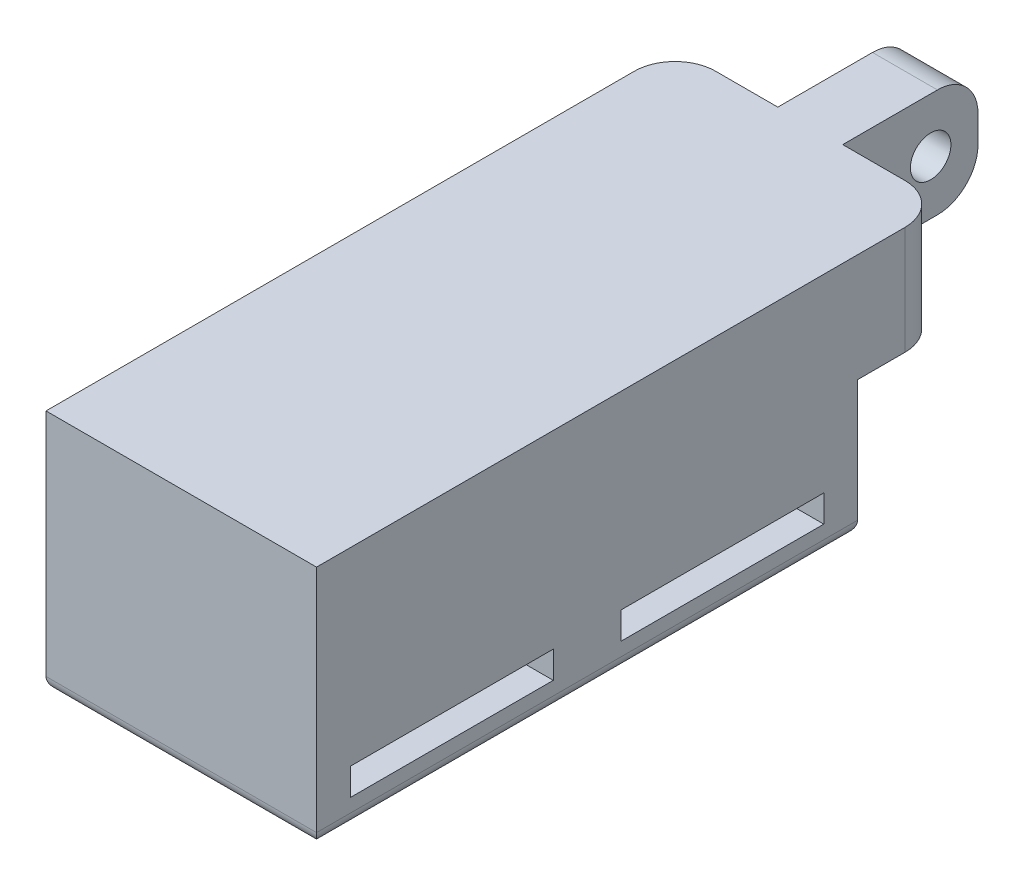
ISO-10303-21;
HEADER;
FILE_DESCRIPTION(('STEP AP214'),'2;1');
FILE_NAME('part.step','',(''),(''),'','','');
FILE_SCHEMA(('AUTOMOTIVE_DESIGN { 1 0 10303 214 1 1 1 1 }'));
ENDSEC;
DATA;
#1=APPLICATION_CONTEXT('core data for automotive mechanical design processes');
#2=APPLICATION_PROTOCOL_DEFINITION('international standard','automotive_design',2000,#1);
#3=PRODUCT_CONTEXT('',#1,'mechanical');
#4=PRODUCT('Part','Part','',(#3));
#5=PRODUCT_RELATED_PRODUCT_CATEGORY('part','',(#4));
#6=PRODUCT_DEFINITION_FORMATION('','',#4);
#7=PRODUCT_DEFINITION_CONTEXT('part definition',#1,'design');
#8=PRODUCT_DEFINITION('design','',#6,#7);
#9=PRODUCT_DEFINITION_SHAPE('','',#8);
#10=(LENGTH_UNIT() NAMED_UNIT(*) SI_UNIT(.MILLI.,.METRE.));
#11=(NAMED_UNIT(*) PLANE_ANGLE_UNIT() SI_UNIT($,.RADIAN.));
#12=(NAMED_UNIT(*) SI_UNIT($,.STERADIAN.) SOLID_ANGLE_UNIT());
#13=UNCERTAINTY_MEASURE_WITH_UNIT(LENGTH_MEASURE(1.E-05),#10,'distance_accuracy_value','');
#14=(GEOMETRIC_REPRESENTATION_CONTEXT(3) GLOBAL_UNCERTAINTY_ASSIGNED_CONTEXT((#13)) GLOBAL_UNIT_ASSIGNED_CONTEXT((#10,
#11,#12)) REPRESENTATION_CONTEXT('',''));
#15=CARTESIAN_POINT('',(0.,0.,0.));
#16=DIRECTION('',(0.,0.,1.));
#17=DIRECTION('',(1.,0.,0.));
#18=AXIS2_PLACEMENT_3D('',#15,#16,#17);
#19=CARTESIAN_POINT('',(10.,0.,0.));
#20=DIRECTION('',(1.,0.,0.));
#21=DIRECTION('',(0.,0.,-1.));
#22=AXIS2_PLACEMENT_3D('',#19,#20,#21);
#23=PLANE('',#22);
#24=DIRECTION('',(0.,1.,0.));
#25=VECTOR('',#24,1.);
#26=CARTESIAN_POINT('',(10.,-5.,40.5));
#27=LINE('',#26,#25);
#28=CARTESIAN_POINT('',(10.,-7.,40.5));
#29=VERTEX_POINT('',#28);
#30=CARTESIAN_POINT('',(10.,-5.,40.5));
#31=VERTEX_POINT('',#30);
#32=EDGE_CURVE('E214',#29,#31,#27,.T.);
#33=ORIENTED_EDGE('',*,*,#32,.F.);
#34=DIRECTION('',(0.,0.,-1.));
#35=VECTOR('',#34,1.);
#36=CARTESIAN_POINT('',(10.,-7.,55.5));
#37=LINE('',#36,#35);
#38=CARTESIAN_POINT('',(10.,-7.,55.5));
#39=VERTEX_POINT('',#38);
#40=EDGE_CURVE('E218',#39,#29,#37,.T.);
#41=ORIENTED_EDGE('',*,*,#40,.F.);
#42=DIRECTION('',(0.,-1.,0.));
#43=VECTOR('',#42,1.);
#44=CARTESIAN_POINT('',(10.,-5.,55.5));
#45=LINE('',#44,#43);
#46=CARTESIAN_POINT('',(10.,-5.,55.5));
#47=VERTEX_POINT('',#46);
#48=EDGE_CURVE('E198',#47,#39,#45,.T.);
#49=ORIENTED_EDGE('',*,*,#48,.F.);
#50=DIRECTION('',(0.,0.,1.));
#51=VECTOR('',#50,1.);
#52=CARTESIAN_POINT('',(10.,-5.,55.5));
#53=LINE('',#52,#51);
#54=EDGE_CURVE('E210',#31,#47,#53,.T.);
#55=ORIENTED_EDGE('',*,*,#54,.F.);
#56=EDGE_LOOP('',(#33,#41,#49,#55));
#57=FACE_BOUND('',#56,.T.);
#58=DIRECTION('',(0.,-1.,0.));
#59=VECTOR('',#58,1.);
#60=CARTESIAN_POINT('',(10.,-5.,35.5));
#61=LINE('',#60,#59);
#62=CARTESIAN_POINT('',(10.,-5.,35.5));
#63=VERTEX_POINT('',#62);
#64=CARTESIAN_POINT('',(10.,-7.,35.5));
#65=VERTEX_POINT('',#64);
#66=EDGE_CURVE('E237',#63,#65,#61,.T.);
#67=ORIENTED_EDGE('',*,*,#66,.F.);
#68=DIRECTION('',(0.,0.,1.));
#69=VECTOR('',#68,1.);
#70=CARTESIAN_POINT('',(10.,-5.,35.5));
#71=LINE('',#70,#69);
#72=CARTESIAN_POINT('',(10.,-5.,20.5));
#73=VERTEX_POINT('',#72);
#74=EDGE_CURVE('E246',#73,#63,#71,.T.);
#75=ORIENTED_EDGE('',*,*,#74,.F.);
#76=DIRECTION('',(0.,1.,0.));
#77=VECTOR('',#76,1.);
#78=CARTESIAN_POINT('',(10.,-5.,20.5));
#79=LINE('',#78,#77);
#80=CARTESIAN_POINT('',(10.,-7.,20.5));
#81=VERTEX_POINT('',#80);
#82=EDGE_CURVE('E243',#81,#73,#79,.T.);
#83=ORIENTED_EDGE('',*,*,#82,.F.);
#84=DIRECTION('',(0.,0.,-1.));
#85=VECTOR('',#84,1.);
#86=CARTESIAN_POINT('',(10.,-7.,35.5));
#87=LINE('',#86,#85);
#88=EDGE_CURVE('E239',#65,#81,#87,.T.);
#89=ORIENTED_EDGE('',*,*,#88,.F.);
#90=EDGE_LOOP('',(#67,#75,#83,#89));
#91=FACE_BOUND('',#90,.T.);
#92=DIRECTION('',(0.,0.,-1.));
#93=VECTOR('',#92,1.);
#94=CARTESIAN_POINT('',(10.,1.,18.));
#95=LINE('',#94,#93);
#96=CARTESIAN_POINT('',(10.,1.,18.));
#97=VERTEX_POINT('',#96);
#98=CARTESIAN_POINT('',(10.,1.,14.5));
#99=VERTEX_POINT('',#98);
#100=EDGE_CURVE('E308',#97,#99,#95,.T.);
#101=ORIENTED_EDGE('',*,*,#100,.T.);
#102=DIRECTION('',(0.,1.,0.));
#103=VECTOR('',#102,1.);
#104=CARTESIAN_POINT('',(10.,9.,14.5));
#105=LINE('',#104,#103);
#106=CARTESIAN_POINT('',(10.,9.,14.5));
#107=VERTEX_POINT('',#106);
#108=EDGE_CURVE('E376',#99,#107,#105,.T.);
#109=ORIENTED_EDGE('',*,*,#108,.T.);
#110=DIRECTION('',(0.,0.,1.));
#111=VECTOR('',#110,1.);
#112=CARTESIAN_POINT('',(10.,9.,1.5));
#113=LINE('',#112,#111);
#114=CARTESIAN_POINT('',(10.,9.,58.));
#115=VERTEX_POINT('',#114);
#116=EDGE_CURVE('E311',#107,#115,#113,.T.);
#117=ORIENTED_EDGE('',*,*,#116,.T.);
#118=DIRECTION('',(0.,-1.,0.));
#119=VECTOR('',#118,1.);
#120=CARTESIAN_POINT('',(10.,9.,58.));
#121=LINE('',#120,#119);
#122=CARTESIAN_POINT('',(10.,-8.,58.));
#123=VERTEX_POINT('',#122);
#124=EDGE_CURVE('E302',#115,#123,#121,.T.);
#125=ORIENTED_EDGE('',*,*,#124,.T.);
#126=DIRECTION('',(0.,0.,-1.));
#127=VECTOR('',#126,1.);
#128=CARTESIAN_POINT('',(10.,-8.,18.));
#129=LINE('',#128,#127);
#130=CARTESIAN_POINT('',(10.,-8.,18.));
#131=VERTEX_POINT('',#130);
#132=EDGE_CURVE('E343',#123,#131,#129,.T.);
#133=ORIENTED_EDGE('',*,*,#132,.T.);
#134=DIRECTION('',(0.,1.,0.));
#135=VECTOR('',#134,1.);
#136=CARTESIAN_POINT('',(10.,1.,18.));
#137=LINE('',#136,#135);
#138=EDGE_CURVE('E305',#131,#97,#137,.T.);
#139=ORIENTED_EDGE('',*,*,#138,.T.);
#140=EDGE_LOOP('',(#101,#109,#117,#125,#133,#139));
#141=FACE_BOUND('',#140,.T.);
#142=ADVANCED_FACE('F33',(#57,#91,#141),#23,.T.);
#143=CARTESIAN_POINT('',(-10.,0.,0.));
#144=DIRECTION('',(1.,0.,0.));
#145=DIRECTION('',(0.,0.,-1.));
#146=AXIS2_PLACEMENT_3D('',#143,#144,#145);
#147=PLANE('',#146);
#148=DIRECTION('',(0.,0.,-1.));
#149=VECTOR('',#148,1.);
#150=CARTESIAN_POINT('',(-10.,-7.,55.5));
#151=LINE('',#150,#149);
#152=CARTESIAN_POINT('',(-10.,-7.,55.5));
#153=VERTEX_POINT('',#152);
#154=CARTESIAN_POINT('',(-10.,-7.,40.5));
#155=VERTEX_POINT('',#154);
#156=EDGE_CURVE('E229',#153,#155,#151,.T.);
#157=ORIENTED_EDGE('',*,*,#156,.T.);
#158=DIRECTION('',(0.,1.,0.));
#159=VECTOR('',#158,1.);
#160=CARTESIAN_POINT('',(-10.,-5.,40.5));
#161=LINE('',#160,#159);
#162=CARTESIAN_POINT('',(-10.,-5.,40.5));
#163=VERTEX_POINT('',#162);
#164=EDGE_CURVE('E220',#155,#163,#161,.T.);
#165=ORIENTED_EDGE('',*,*,#164,.T.);
#166=DIRECTION('',(0.,0.,1.));
#167=VECTOR('',#166,1.);
#168=CARTESIAN_POINT('',(-10.,-5.,55.5));
#169=LINE('',#168,#167);
#170=CARTESIAN_POINT('',(-10.,-5.,55.5));
#171=VERTEX_POINT('',#170);
#172=EDGE_CURVE('E226',#163,#171,#169,.T.);
#173=ORIENTED_EDGE('',*,*,#172,.T.);
#174=DIRECTION('',(0.,-1.,0.));
#175=VECTOR('',#174,1.);
#176=CARTESIAN_POINT('',(-10.,-5.,55.5));
#177=LINE('',#176,#175);
#178=EDGE_CURVE('E201',#171,#153,#177,.T.);
#179=ORIENTED_EDGE('',*,*,#178,.T.);
#180=EDGE_LOOP('',(#157,#165,#173,#179));
#181=FACE_BOUND('',#180,.T.);
#182=DIRECTION('',(0.,0.,1.));
#183=VECTOR('',#182,1.);
#184=CARTESIAN_POINT('',(-10.,-5.,35.5));
#185=LINE('',#184,#183);
#186=CARTESIAN_POINT('',(-10.,-5.,20.5));
#187=VERTEX_POINT('',#186);
#188=CARTESIAN_POINT('',(-10.,-5.,35.5));
#189=VERTEX_POINT('',#188);
#190=EDGE_CURVE('E258',#187,#189,#185,.T.);
#191=ORIENTED_EDGE('',*,*,#190,.T.);
#192=DIRECTION('',(0.,-1.,0.));
#193=VECTOR('',#192,1.);
#194=CARTESIAN_POINT('',(-10.,-5.,35.5));
#195=LINE('',#194,#193);
#196=CARTESIAN_POINT('',(-10.,-7.,35.5));
#197=VERTEX_POINT('',#196);
#198=EDGE_CURVE('E249',#189,#197,#195,.T.);
#199=ORIENTED_EDGE('',*,*,#198,.T.);
#200=DIRECTION('',(0.,0.,-1.));
#201=VECTOR('',#200,1.);
#202=CARTESIAN_POINT('',(-10.,-7.,35.5));
#203=LINE('',#202,#201);
#204=CARTESIAN_POINT('',(-10.,-7.,20.5));
#205=VERTEX_POINT('',#204);
#206=EDGE_CURVE('E252',#197,#205,#203,.T.);
#207=ORIENTED_EDGE('',*,*,#206,.T.);
#208=DIRECTION('',(0.,1.,0.));
#209=VECTOR('',#208,1.);
#210=CARTESIAN_POINT('',(-10.,-5.,20.5));
#211=LINE('',#210,#209);
#212=EDGE_CURVE('E255',#205,#187,#211,.T.);
#213=ORIENTED_EDGE('',*,*,#212,.T.);
#214=EDGE_LOOP('',(#191,#199,#207,#213));
#215=FACE_BOUND('',#214,.T.);
#216=DIRECTION('',(0.,0.,1.));
#217=VECTOR('',#216,1.);
#218=CARTESIAN_POINT('',(-10.,9.,1.5));
#219=LINE('',#218,#217);
#220=CARTESIAN_POINT('',(-10.,9.,14.5));
#221=VERTEX_POINT('',#220);
#222=CARTESIAN_POINT('',(-10.,9.,58.));
#223=VERTEX_POINT('',#222);
#224=EDGE_CURVE('E306',#221,#223,#219,.T.);
#225=ORIENTED_EDGE('',*,*,#224,.F.);
#226=DIRECTION('',(0.,1.,0.));
#227=VECTOR('',#226,1.);
#228=CARTESIAN_POINT('',(-10.,0.,14.5));
#229=LINE('',#228,#227);
#230=CARTESIAN_POINT('',(-10.,1.,14.5));
#231=VERTEX_POINT('',#230);
#232=EDGE_CURVE('E368',#221,#231,#229,.F.);
#233=ORIENTED_EDGE('',*,*,#232,.T.);
#234=DIRECTION('',(0.,0.,-1.));
#235=VECTOR('',#234,1.);
#236=CARTESIAN_POINT('',(-10.,1.,18.));
#237=LINE('',#236,#235);
#238=CARTESIAN_POINT('',(-10.,1.,18.));
#239=VERTEX_POINT('',#238);
#240=EDGE_CURVE('E318',#239,#231,#237,.T.);
#241=ORIENTED_EDGE('',*,*,#240,.F.);
#242=DIRECTION('',(0.,1.,0.));
#243=VECTOR('',#242,1.);
#244=CARTESIAN_POINT('',(-10.,1.,18.));
#245=LINE('',#244,#243);
#246=CARTESIAN_POINT('',(-10.,-8.,18.));
#247=VERTEX_POINT('',#246);
#248=EDGE_CURVE('E316',#247,#239,#245,.T.);
#249=ORIENTED_EDGE('',*,*,#248,.F.);
#250=DIRECTION('',(0.,0.,-1.));
#251=VECTOR('',#250,1.);
#252=CARTESIAN_POINT('',(-10.,-8.00000000000001,0.));
#253=LINE('',#252,#251);
#254=CARTESIAN_POINT('',(-10.,-8.,58.));
#255=VERTEX_POINT('',#254);
#256=EDGE_CURVE('E347',#247,#255,#253,.F.);
#257=ORIENTED_EDGE('',*,*,#256,.T.);
#258=DIRECTION('',(0.,-1.,0.));
#259=VECTOR('',#258,1.);
#260=CARTESIAN_POINT('',(-10.,9.,58.));
#261=LINE('',#260,#259);
#262=EDGE_CURVE('E301',#223,#255,#261,.T.);
#263=ORIENTED_EDGE('',*,*,#262,.F.);
#264=EDGE_LOOP('',(#225,#233,#241,#249,#257,#263));
#265=FACE_BOUND('',#264,.T.);
#266=ADVANCED_FACE('F423',(#181,#215,#265),#147,.F.);
#267=CARTESIAN_POINT('',(10.,9.,58.));
#268=DIRECTION('',(0.,0.,-1.));
#269=DIRECTION('',(-1.,0.,0.));
#270=AXIS2_PLACEMENT_3D('',#267,#268,#269);
#271=PLANE('',#270);
#272=ORIENTED_EDGE('',*,*,#262,.T.);
#273=DIRECTION('',(-1.,0.,0.));
#274=VECTOR('',#273,1.);
#275=CARTESIAN_POINT('',(10.,-8.,58.));
#276=LINE('',#275,#274);
#277=EDGE_CURVE('E340',#255,#123,#276,.F.);
#278=ORIENTED_EDGE('',*,*,#277,.T.);
#279=ORIENTED_EDGE('',*,*,#124,.F.);
#280=DIRECTION('',(-1.,0.,0.));
#281=VECTOR('',#280,1.);
#282=CARTESIAN_POINT('',(10.,9.,58.));
#283=LINE('',#282,#281);
#284=EDGE_CURVE('E313',#115,#223,#283,.T.);
#285=ORIENTED_EDGE('',*,*,#284,.T.);
#286=EDGE_LOOP('',(#272,#278,#279,#285));
#287=FACE_BOUND('',#286,.T.);
#288=ADVANCED_FACE('F429',(#287),#271,.F.);
#289=CARTESIAN_POINT('',(10.,-9.,58.));
#290=DIRECTION('',(0.,1.,0.));
#291=DIRECTION('',(0.,0.,1.));
#292=AXIS2_PLACEMENT_3D('',#289,#290,#291);
#293=PLANE('',#292);
#294=DIRECTION('',(0.,0.,-1.));
#295=VECTOR('',#294,1.);
#296=CARTESIAN_POINT('',(9.,-9.,58.));
#297=LINE('',#296,#295);
#298=CARTESIAN_POINT('',(9.,-9.00000000000001,19.));
#299=VERTEX_POINT('',#298);
#300=CARTESIAN_POINT('',(9.,-9.,57.));
#301=VERTEX_POINT('',#300);
#302=EDGE_CURVE('E335',#299,#301,#297,.F.);
#303=ORIENTED_EDGE('',*,*,#302,.T.);
#304=DIRECTION('',(-1.,0.,0.));
#305=VECTOR('',#304,1.);
#306=CARTESIAN_POINT('',(10.,-9.,57.));
#307=LINE('',#306,#305);
#308=CARTESIAN_POINT('',(-9.,-9.,57.));
#309=VERTEX_POINT('',#308);
#310=EDGE_CURVE('E337',#301,#309,#307,.T.);
#311=ORIENTED_EDGE('',*,*,#310,.T.);
#312=DIRECTION('',(0.,0.,-1.));
#313=VECTOR('',#312,1.);
#314=CARTESIAN_POINT('',(-9.,-9.,58.));
#315=LINE('',#314,#313);
#316=CARTESIAN_POINT('',(-9.,-9.00000000000001,19.));
#317=VERTEX_POINT('',#316);
#318=EDGE_CURVE('E327',#309,#317,#315,.T.);
#319=ORIENTED_EDGE('',*,*,#318,.T.);
#320=DIRECTION('',(-1.,0.,0.));
#321=VECTOR('',#320,1.);
#322=CARTESIAN_POINT('',(10.,-9.00000000000001,19.));
#323=LINE('',#322,#321);
#324=EDGE_CURVE('E333',#317,#299,#323,.F.);
#325=ORIENTED_EDGE('',*,*,#324,.T.);
#326=EDGE_LOOP('',(#303,#311,#319,#325));
#327=FACE_BOUND('',#326,.T.);
#328=ADVANCED_FACE('F443',(#327),#293,.F.);
#329=CARTESIAN_POINT('',(10.,1.,18.));
#330=DIRECTION('',(0.,0.,1.));
#331=DIRECTION('',(1.,0.,0.));
#332=AXIS2_PLACEMENT_3D('',#329,#330,#331);
#333=PLANE('',#332);
#334=ORIENTED_EDGE('',*,*,#138,.F.);
#335=DIRECTION('',(-1.,0.,0.));
#336=VECTOR('',#335,1.);
#337=CARTESIAN_POINT('',(10.,-8.,18.));
#338=LINE('',#337,#336);
#339=EDGE_CURVE('E345',#131,#247,#338,.T.);
#340=ORIENTED_EDGE('',*,*,#339,.T.);
#341=ORIENTED_EDGE('',*,*,#248,.T.);
#342=DIRECTION('',(-1.,0.,0.));
#343=VECTOR('',#342,1.);
#344=CARTESIAN_POINT('',(10.,1.,18.));
#345=LINE('',#344,#343);
#346=EDGE_CURVE('E324',#97,#239,#345,.T.);
#347=ORIENTED_EDGE('',*,*,#346,.F.);
#348=EDGE_LOOP('',(#334,#340,#341,#347));
#349=FACE_BOUND('',#348,.T.);
#350=ADVANCED_FACE('F453',(#349),#333,.F.);
#351=CARTESIAN_POINT('',(10.,1.,18.));
#352=DIRECTION('',(0.,1.,0.));
#353=DIRECTION('',(0.,0.,1.));
#354=AXIS2_PLACEMENT_3D('',#351,#352,#353);
#355=PLANE('',#354);
#356=ORIENTED_EDGE('',*,*,#240,.T.);
#357=CARTESIAN_POINT('',(-7.,1.,14.5));
#358=DIRECTION('',(0.,1.,0.));
#359=DIRECTION('',(0.,0.,1.));
#360=AXIS2_PLACEMENT_3D('',#357,#358,#359);
#361=CIRCLE('',#360,3.);
#362=CARTESIAN_POINT('',(-7.,1.,11.5));
#363=VERTEX_POINT('',#362);
#364=EDGE_CURVE('E374',#231,#363,#361,.F.);
#365=ORIENTED_EDGE('',*,*,#364,.T.);
#366=DIRECTION('',(1.,0.,0.));
#367=VECTOR('',#366,1.);
#368=CARTESIAN_POINT('',(10.,1.,11.5));
#369=LINE('',#368,#367);
#370=CARTESIAN_POINT('',(-2.4,1.,11.5));
#371=VERTEX_POINT('',#370);
#372=EDGE_CURVE('E299',#363,#371,#369,.T.);
#373=ORIENTED_EDGE('',*,*,#372,.T.);
#374=DIRECTION('',(0.,0.,-1.));
#375=VECTOR('',#374,1.);
#376=CARTESIAN_POINT('',(-2.4,1.,18.));
#377=LINE('',#376,#375);
#378=CARTESIAN_POINT('',(-2.4,1.,4.5));
#379=VERTEX_POINT('',#378);
#380=EDGE_CURVE('E293',#371,#379,#377,.T.);
#381=ORIENTED_EDGE('',*,*,#380,.T.);
#382=DIRECTION('',(-1.,0.,0.));
#383=VECTOR('',#382,1.);
#384=CARTESIAN_POINT('',(10.,1.,4.5));
#385=LINE('',#384,#383);
#386=CARTESIAN_POINT('',(2.4,1.,4.5));
#387=VERTEX_POINT('',#386);
#388=EDGE_CURVE('E370',#379,#387,#385,.F.);
#389=ORIENTED_EDGE('',*,*,#388,.T.);
#390=DIRECTION('',(0.,0.,1.));
#391=VECTOR('',#390,1.);
#392=CARTESIAN_POINT('',(2.4,1.,18.));
#393=LINE('',#392,#391);
#394=CARTESIAN_POINT('',(2.4,1.,11.5));
#395=VERTEX_POINT('',#394);
#396=EDGE_CURVE('E290',#387,#395,#393,.T.);
#397=ORIENTED_EDGE('',*,*,#396,.T.);
#398=DIRECTION('',(1.,0.,0.));
#399=VECTOR('',#398,1.);
#400=CARTESIAN_POINT('',(10.,1.,11.5));
#401=LINE('',#400,#399);
#402=CARTESIAN_POINT('',(7.,1.,11.5));
#403=VERTEX_POINT('',#402);
#404=EDGE_CURVE('E296',#395,#403,#401,.T.);
#405=ORIENTED_EDGE('',*,*,#404,.T.);
#406=CARTESIAN_POINT('',(7.,1.,14.5));
#407=DIRECTION('',(0.,1.,0.));
#408=DIRECTION('',(0.,0.,1.));
#409=AXIS2_PLACEMENT_3D('',#406,#407,#408);
#410=CIRCLE('',#409,3.);
#411=EDGE_CURVE('E372',#403,#99,#410,.F.);
#412=ORIENTED_EDGE('',*,*,#411,.T.);
#413=ORIENTED_EDGE('',*,*,#100,.F.);
#414=ORIENTED_EDGE('',*,*,#346,.T.);
#415=EDGE_LOOP('',(#356,#365,#373,#381,#389,#397,#405,#412,#413,#414));
#416=FACE_BOUND('',#415,.T.);
#417=ADVANCED_FACE('F410',(#416),#355,.F.);
#418=CARTESIAN_POINT('',(10.,9.,1.5));
#419=DIRECTION('',(0.,0.,1.));
#420=DIRECTION('',(0.,-1.,0.));
#421=AXIS2_PLACEMENT_3D('',#418,#419,#420);
#422=PLANE('',#421);
#423=DIRECTION('',(0.,1.,0.));
#424=VECTOR('',#423,1.);
#425=CARTESIAN_POINT('',(2.4,-9.00000000000001,1.5));
#426=LINE('',#425,#424);
#427=CARTESIAN_POINT('',(2.4,4.,1.5));
#428=VERTEX_POINT('',#427);
#429=CARTESIAN_POINT('',(2.4,6.,1.5));
#430=VERTEX_POINT('',#429);
#431=EDGE_CURVE('E286',#428,#430,#426,.T.);
#432=ORIENTED_EDGE('',*,*,#431,.F.);
#433=DIRECTION('',(-1.,0.,0.));
#434=VECTOR('',#433,1.);
#435=CARTESIAN_POINT('',(10.,4.,1.5));
#436=LINE('',#435,#434);
#437=CARTESIAN_POINT('',(-2.4,4.,1.5));
#438=VERTEX_POINT('',#437);
#439=EDGE_CURVE('E382',#428,#438,#436,.T.);
#440=ORIENTED_EDGE('',*,*,#439,.T.);
#441=DIRECTION('',(0.,1.,0.));
#442=VECTOR('',#441,1.);
#443=CARTESIAN_POINT('',(-2.4,-9.00000000000001,1.5));
#444=LINE('',#443,#442);
#445=CARTESIAN_POINT('',(-2.4,6.,1.5));
#446=VERTEX_POINT('',#445);
#447=EDGE_CURVE('E277',#438,#446,#444,.T.);
#448=ORIENTED_EDGE('',*,*,#447,.T.);
#449=DIRECTION('',(-1.,0.,0.));
#450=VECTOR('',#449,1.);
#451=CARTESIAN_POINT('',(10.,6.,1.5));
#452=LINE('',#451,#450);
#453=EDGE_CURVE('E48',#446,#430,#452,.F.);
#454=ORIENTED_EDGE('',*,*,#453,.T.);
#455=EDGE_LOOP('',(#432,#440,#448,#454));
#456=FACE_BOUND('',#455,.T.);
#457=ADVANCED_FACE('F402',(#456),#422,.F.);
#458=CARTESIAN_POINT('',(10.,9.,1.5));
#459=DIRECTION('',(0.,-1.,0.));
#460=DIRECTION('',(0.,0.,-1.));
#461=AXIS2_PLACEMENT_3D('',#458,#459,#460);
#462=PLANE('',#461);
#463=DIRECTION('',(1.,0.,0.));
#464=VECTOR('',#463,1.);
#465=CARTESIAN_POINT('',(-2.4,9.,11.5));
#466=LINE('',#465,#464);
#467=CARTESIAN_POINT('',(-7.,9.,11.5));
#468=VERTEX_POINT('',#467);
#469=CARTESIAN_POINT('',(-2.4,9.,11.5));
#470=VERTEX_POINT('',#469);
#471=EDGE_CURVE('E270',#468,#470,#466,.T.);
#472=ORIENTED_EDGE('',*,*,#471,.F.);
#473=CARTESIAN_POINT('',(-7.,9.,14.5));
#474=DIRECTION('',(0.,-1.,0.));
#475=DIRECTION('',(0.,0.,-1.));
#476=AXIS2_PLACEMENT_3D('',#473,#474,#475);
#477=CIRCLE('',#476,3.);
#478=EDGE_CURVE('E366',#468,#221,#477,.F.);
#479=ORIENTED_EDGE('',*,*,#478,.T.);
#480=ORIENTED_EDGE('',*,*,#224,.T.);
#481=ORIENTED_EDGE('',*,*,#284,.F.);
#482=ORIENTED_EDGE('',*,*,#116,.F.);
#483=CARTESIAN_POINT('',(7.,9.,14.5));
#484=DIRECTION('',(0.,-1.,0.));
#485=DIRECTION('',(0.,0.,-1.));
#486=AXIS2_PLACEMENT_3D('',#483,#484,#485);
#487=CIRCLE('',#486,3.);
#488=CARTESIAN_POINT('',(7.,9.,11.5));
#489=VERTEX_POINT('',#488);
#490=EDGE_CURVE('E364',#107,#489,#487,.F.);
#491=ORIENTED_EDGE('',*,*,#490,.T.);
#492=DIRECTION('',(1.,0.,0.));
#493=VECTOR('',#492,1.);
#494=CARTESIAN_POINT('',(2.4,9.,11.5));
#495=LINE('',#494,#493);
#496=CARTESIAN_POINT('',(2.4,9.,11.5));
#497=VERTEX_POINT('',#496);
#498=EDGE_CURVE('E234',#497,#489,#495,.T.);
#499=ORIENTED_EDGE('',*,*,#498,.F.);
#500=DIRECTION('',(0.,0.,1.));
#501=VECTOR('',#500,1.);
#502=CARTESIAN_POINT('',(2.4,9.,1.5));
#503=LINE('',#502,#501);
#504=CARTESIAN_POINT('',(2.4,9.,4.5));
#505=VERTEX_POINT('',#504);
#506=EDGE_CURVE('E284',#505,#497,#503,.T.);
#507=ORIENTED_EDGE('',*,*,#506,.F.);
#508=DIRECTION('',(-1.,0.,0.));
#509=VECTOR('',#508,1.);
#510=CARTESIAN_POINT('',(10.,9.,4.5));
#511=LINE('',#510,#509);
#512=CARTESIAN_POINT('',(-2.4,9.,4.5));
#513=VERTEX_POINT('',#512);
#514=EDGE_CURVE('E361',#505,#513,#511,.T.);
#515=ORIENTED_EDGE('',*,*,#514,.T.);
#516=DIRECTION('',(0.,0.,-1.));
#517=VECTOR('',#516,1.);
#518=CARTESIAN_POINT('',(-2.4,9.,1.5));
#519=LINE('',#518,#517);
#520=EDGE_CURVE('E272',#470,#513,#519,.T.);
#521=ORIENTED_EDGE('',*,*,#520,.F.);
#522=EDGE_LOOP('',(#472,#479,#480,#481,#482,#491,#499,#507,#515,#521));
#523=FACE_BOUND('',#522,.T.);
#524=ADVANCED_FACE('F397',(#523),#462,.F.);
#525=CARTESIAN_POINT('',(2.4,-9.00000000000001,11.5));
#526=DIRECTION('',(0.,0.,1.));
#527=DIRECTION('',(1.,0.,0.));
#528=AXIS2_PLACEMENT_3D('',#525,#526,#527);
#529=PLANE('',#528);
#530=ORIENTED_EDGE('',*,*,#498,.T.);
#531=DIRECTION('',(0.,1.,0.));
#532=VECTOR('',#531,1.);
#533=CARTESIAN_POINT('',(7.,1.,11.5));
#534=LINE('',#533,#532);
#535=EDGE_CURVE('E379',#489,#403,#534,.F.);
#536=ORIENTED_EDGE('',*,*,#535,.T.);
#537=ORIENTED_EDGE('',*,*,#404,.F.);
#538=DIRECTION('',(0.,1.,0.));
#539=VECTOR('',#538,1.);
#540=CARTESIAN_POINT('',(2.4,-9.00000000000001,11.5));
#541=LINE('',#540,#539);
#542=EDGE_CURVE('E273',#395,#497,#541,.T.);
#543=ORIENTED_EDGE('',*,*,#542,.T.);
#544=EDGE_LOOP('',(#530,#536,#537,#543));
#545=FACE_BOUND('',#544,.T.);
#546=ADVANCED_FACE('F479',(#545),#529,.F.);
#547=CARTESIAN_POINT('',(2.4,-9.00000000000001,1.5));
#548=DIRECTION('',(-1.,0.,0.));
#549=DIRECTION('',(0.,0.,1.));
#550=AXIS2_PLACEMENT_3D('',#547,#548,#549);
#551=PLANE('',#550);
#552=CARTESIAN_POINT('',(2.4,5.,5.));
#553=DIRECTION('',(-1.,0.,0.));
#554=DIRECTION('',(0.,0.,1.));
#555=AXIS2_PLACEMENT_3D('',#552,#553,#554);
#556=CIRCLE('',#555,1.5);
#557=CARTESIAN_POINT('',(2.4,5.,6.5));
#558=VERTEX_POINT('',#557);
#559=EDGE_CURVE('E279',#558,#558,#556,.T.);
#560=ORIENTED_EDGE('',*,*,#559,.T.);
#561=EDGE_LOOP('',(#560));
#562=FACE_BOUND('',#561,.T.);
#563=ORIENTED_EDGE('',*,*,#396,.F.);
#564=CARTESIAN_POINT('',(2.4,4.,4.5));
#565=DIRECTION('',(-1.,0.,0.));
#566=DIRECTION('',(0.,0.,1.));
#567=AXIS2_PLACEMENT_3D('',#564,#565,#566);
#568=CIRCLE('',#567,3.);
#569=EDGE_CURVE('E11',#387,#428,#568,.F.);
#570=ORIENTED_EDGE('',*,*,#569,.T.);
#571=ORIENTED_EDGE('',*,*,#431,.T.);
#572=CARTESIAN_POINT('',(2.4,6.,4.5));
#573=DIRECTION('',(-1.,0.,0.));
#574=DIRECTION('',(0.,0.,1.));
#575=AXIS2_PLACEMENT_3D('',#572,#573,#574);
#576=CIRCLE('',#575,3.);
#577=EDGE_CURVE('E41',#430,#505,#576,.F.);
#578=ORIENTED_EDGE('',*,*,#577,.T.);
#579=ORIENTED_EDGE('',*,*,#506,.T.);
#580=ORIENTED_EDGE('',*,*,#542,.F.);
#581=EDGE_LOOP('',(#563,#570,#571,#578,#579,#580));
#582=FACE_BOUND('',#581,.T.);
#583=ADVANCED_FACE('F390',(#562,#582),#551,.F.);
#584=CARTESIAN_POINT('',(-2.4,-9.00000000000001,11.5));
#585=DIRECTION('',(0.,0.,1.));
#586=DIRECTION('',(1.,0.,0.));
#587=AXIS2_PLACEMENT_3D('',#584,#585,#586);
#588=PLANE('',#587);
#589=ORIENTED_EDGE('',*,*,#372,.F.);
#590=DIRECTION('',(0.,1.,0.));
#591=VECTOR('',#590,1.);
#592=CARTESIAN_POINT('',(-7.,-9.00000000000001,11.5));
#593=LINE('',#592,#591);
#594=EDGE_CURVE('E349',#363,#468,#593,.T.);
#595=ORIENTED_EDGE('',*,*,#594,.T.);
#596=ORIENTED_EDGE('',*,*,#471,.T.);
#597=DIRECTION('',(0.,1.,0.));
#598=VECTOR('',#597,1.);
#599=CARTESIAN_POINT('',(-2.4,-9.00000000000001,11.5));
#600=LINE('',#599,#598);
#601=EDGE_CURVE('E276',#371,#470,#600,.T.);
#602=ORIENTED_EDGE('',*,*,#601,.F.);
#603=EDGE_LOOP('',(#589,#595,#596,#602));
#604=FACE_BOUND('',#603,.T.);
#605=ADVANCED_FACE('F415',(#604),#588,.F.);
#606=CARTESIAN_POINT('',(-2.4,-9.00000000000001,1.5));
#607=DIRECTION('',(1.,0.,0.));
#608=DIRECTION('',(0.,0.,-1.));
#609=AXIS2_PLACEMENT_3D('',#606,#607,#608);
#610=PLANE('',#609);
#611=CARTESIAN_POINT('',(-2.4,5.,5.));
#612=DIRECTION('',(1.,0.,0.));
#613=DIRECTION('',(0.,0.,-1.));
#614=AXIS2_PLACEMENT_3D('',#611,#612,#613);
#615=CIRCLE('',#614,1.5);
#616=CARTESIAN_POINT('',(-2.4,5.,3.5));
#617=VERTEX_POINT('',#616);
#618=EDGE_CURVE('E292',#617,#617,#615,.T.);
#619=ORIENTED_EDGE('',*,*,#618,.T.);
#620=EDGE_LOOP('',(#619));
#621=FACE_BOUND('',#620,.T.);
#622=ORIENTED_EDGE('',*,*,#447,.F.);
#623=CARTESIAN_POINT('',(-2.4,4.,4.5));
#624=DIRECTION('',(1.,0.,0.));
#625=DIRECTION('',(0.,0.,-1.));
#626=AXIS2_PLACEMENT_3D('',#623,#624,#625);
#627=CIRCLE('',#626,3.);
#628=EDGE_CURVE('E387',#438,#379,#627,.F.);
#629=ORIENTED_EDGE('',*,*,#628,.T.);
#630=ORIENTED_EDGE('',*,*,#380,.F.);
#631=ORIENTED_EDGE('',*,*,#601,.T.);
#632=ORIENTED_EDGE('',*,*,#520,.T.);
#633=CARTESIAN_POINT('',(-2.4,6.,4.5));
#634=DIRECTION('',(1.,0.,0.));
#635=DIRECTION('',(0.,0.,-1.));
#636=AXIS2_PLACEMENT_3D('',#633,#634,#635);
#637=CIRCLE('',#636,3.);
#638=EDGE_CURVE('E385',#513,#446,#637,.F.);
#639=ORIENTED_EDGE('',*,*,#638,.T.);
#640=EDGE_LOOP('',(#622,#629,#630,#631,#632,#639));
#641=FACE_BOUND('',#640,.T.);
#642=ADVANCED_FACE('F401',(#621,#641),#610,.F.);
#643=CARTESIAN_POINT('',(10.,5.,5.));
#644=DIRECTION('',(-1.,0.,0.));
#645=DIRECTION('',(0.,0.,1.));
#646=AXIS2_PLACEMENT_3D('',#643,#644,#645);
#647=CYLINDRICAL_SURFACE('',#646,1.5);
#648=ORIENTED_EDGE('',*,*,#618,.F.);
#649=EDGE_LOOP('',(#648));
#650=FACE_BOUND('',#649,.T.);
#651=ORIENTED_EDGE('',*,*,#559,.F.);
#652=EDGE_LOOP('',(#651));
#653=FACE_BOUND('',#652,.T.);
#654=ADVANCED_FACE('F474',(#650,#653),#647,.F.);
#655=CARTESIAN_POINT('',(-10.,-5.,35.5));
#656=DIRECTION('',(0.,0.,1.));
#657=DIRECTION('',(1.,0.,0.));
#658=AXIS2_PLACEMENT_3D('',#655,#656,#657);
#659=PLANE('',#658);
#660=DIRECTION('',(1.,0.,0.));
#661=VECTOR('',#660,1.);
#662=CARTESIAN_POINT('',(-10.,-7.,35.5));
#663=LINE('',#662,#661);
#664=EDGE_CURVE('E261',#197,#65,#663,.T.);
#665=ORIENTED_EDGE('',*,*,#664,.F.);
#666=ORIENTED_EDGE('',*,*,#198,.F.);
#667=DIRECTION('',(1.,0.,0.));
#668=VECTOR('',#667,1.);
#669=CARTESIAN_POINT('',(-10.,-5.,35.5));
#670=LINE('',#669,#668);
#671=EDGE_CURVE('E262',#189,#63,#670,.T.);
#672=ORIENTED_EDGE('',*,*,#671,.T.);
#673=ORIENTED_EDGE('',*,*,#66,.T.);
#674=EDGE_LOOP('',(#665,#666,#672,#673));
#675=FACE_BOUND('',#674,.T.);
#676=ADVANCED_FACE('F604',(#675),#659,.F.);
#677=CARTESIAN_POINT('',(-10.,-5.,35.5));
#678=DIRECTION('',(0.,1.,0.));
#679=DIRECTION('',(0.,0.,1.));
#680=AXIS2_PLACEMENT_3D('',#677,#678,#679);
#681=PLANE('',#680);
#682=ORIENTED_EDGE('',*,*,#671,.F.);
#683=ORIENTED_EDGE('',*,*,#190,.F.);
#684=DIRECTION('',(1.,0.,0.));
#685=VECTOR('',#684,1.);
#686=CARTESIAN_POINT('',(-10.,-5.,20.5));
#687=LINE('',#686,#685);
#688=EDGE_CURVE('E264',#187,#73,#687,.T.);
#689=ORIENTED_EDGE('',*,*,#688,.T.);
#690=ORIENTED_EDGE('',*,*,#74,.T.);
#691=EDGE_LOOP('',(#682,#683,#689,#690));
#692=FACE_BOUND('',#691,.T.);
#693=ADVANCED_FACE('F595',(#692),#681,.F.);
#694=CARTESIAN_POINT('',(-10.,-5.,20.5));
#695=DIRECTION('',(0.,0.,-1.));
#696=DIRECTION('',(-1.,0.,0.));
#697=AXIS2_PLACEMENT_3D('',#694,#695,#696);
#698=PLANE('',#697);
#699=ORIENTED_EDGE('',*,*,#688,.F.);
#700=ORIENTED_EDGE('',*,*,#212,.F.);
#701=DIRECTION('',(1.,0.,0.));
#702=VECTOR('',#701,1.);
#703=CARTESIAN_POINT('',(-10.,-7.,20.5));
#704=LINE('',#703,#702);
#705=EDGE_CURVE('E266',#205,#81,#704,.T.);
#706=ORIENTED_EDGE('',*,*,#705,.T.);
#707=ORIENTED_EDGE('',*,*,#82,.T.);
#708=EDGE_LOOP('',(#699,#700,#706,#707));
#709=FACE_BOUND('',#708,.T.);
#710=ADVANCED_FACE('F586',(#709),#698,.F.);
#711=CARTESIAN_POINT('',(-10.,-7.,35.5));
#712=DIRECTION('',(0.,-1.,0.));
#713=DIRECTION('',(0.,0.,-1.));
#714=AXIS2_PLACEMENT_3D('',#711,#712,#713);
#715=PLANE('',#714);
#716=ORIENTED_EDGE('',*,*,#705,.F.);
#717=ORIENTED_EDGE('',*,*,#206,.F.);
#718=ORIENTED_EDGE('',*,*,#664,.T.);
#719=ORIENTED_EDGE('',*,*,#88,.T.);
#720=EDGE_LOOP('',(#716,#717,#718,#719));
#721=FACE_BOUND('',#720,.T.);
#722=ADVANCED_FACE('F577',(#721),#715,.F.);
#723=CARTESIAN_POINT('',(-10.,-5.,40.5));
#724=DIRECTION('',(0.,0.,-1.));
#725=DIRECTION('',(-1.,0.,0.));
#726=AXIS2_PLACEMENT_3D('',#723,#724,#725);
#727=PLANE('',#726);
#728=DIRECTION('',(1.,0.,0.));
#729=VECTOR('',#728,1.);
#730=CARTESIAN_POINT('',(-10.,-5.,40.5));
#731=LINE('',#730,#729);
#732=EDGE_CURVE('E206',#163,#31,#731,.T.);
#733=ORIENTED_EDGE('',*,*,#732,.F.);
#734=ORIENTED_EDGE('',*,*,#164,.F.);
#735=DIRECTION('',(1.,0.,0.));
#736=VECTOR('',#735,1.);
#737=CARTESIAN_POINT('',(-10.,-7.,40.5));
#738=LINE('',#737,#736);
#739=EDGE_CURVE('E232',#155,#29,#738,.T.);
#740=ORIENTED_EDGE('',*,*,#739,.T.);
#741=ORIENTED_EDGE('',*,*,#32,.T.);
#742=EDGE_LOOP('',(#733,#734,#740,#741));
#743=FACE_BOUND('',#742,.T.);
#744=ADVANCED_FACE('F568',(#743),#727,.F.);
#745=CARTESIAN_POINT('',(-10.,-7.,55.5));
#746=DIRECTION('',(0.,-1.,0.));
#747=DIRECTION('',(0.,0.,-1.));
#748=AXIS2_PLACEMENT_3D('',#745,#746,#747);
#749=PLANE('',#748);
#750=ORIENTED_EDGE('',*,*,#739,.F.);
#751=ORIENTED_EDGE('',*,*,#156,.F.);
#752=DIRECTION('',(1.,0.,0.));
#753=VECTOR('',#752,1.);
#754=CARTESIAN_POINT('',(-10.,-7.,55.5));
#755=LINE('',#754,#753);
#756=EDGE_CURVE('E205',#153,#39,#755,.T.);
#757=ORIENTED_EDGE('',*,*,#756,.T.);
#758=ORIENTED_EDGE('',*,*,#40,.T.);
#759=EDGE_LOOP('',(#750,#751,#757,#758));
#760=FACE_BOUND('',#759,.T.);
#761=ADVANCED_FACE('F560',(#760),#749,.F.);
#762=CARTESIAN_POINT('',(-10.,-5.,55.5));
#763=DIRECTION('',(0.,0.,1.));
#764=DIRECTION('',(1.,0.,0.));
#765=AXIS2_PLACEMENT_3D('',#762,#763,#764);
#766=PLANE('',#765);
#767=ORIENTED_EDGE('',*,*,#756,.F.);
#768=ORIENTED_EDGE('',*,*,#178,.F.);
#769=DIRECTION('',(1.,0.,0.));
#770=VECTOR('',#769,1.);
#771=CARTESIAN_POINT('',(-10.,-5.,55.5));
#772=LINE('',#771,#770);
#773=EDGE_CURVE('E194',#171,#47,#772,.T.);
#774=ORIENTED_EDGE('',*,*,#773,.T.);
#775=ORIENTED_EDGE('',*,*,#48,.T.);
#776=EDGE_LOOP('',(#767,#768,#774,#775));
#777=FACE_BOUND('',#776,.T.);
#778=ADVANCED_FACE('F196',(#777),#766,.F.);
#779=CARTESIAN_POINT('',(-10.,-5.,55.5));
#780=DIRECTION('',(0.,1.,0.));
#781=DIRECTION('',(0.,0.,1.));
#782=AXIS2_PLACEMENT_3D('',#779,#780,#781);
#783=PLANE('',#782);
#784=ORIENTED_EDGE('',*,*,#773,.F.);
#785=ORIENTED_EDGE('',*,*,#172,.F.);
#786=ORIENTED_EDGE('',*,*,#732,.T.);
#787=ORIENTED_EDGE('',*,*,#54,.T.);
#788=EDGE_LOOP('',(#784,#785,#786,#787));
#789=FACE_BOUND('',#788,.T.);
#790=ADVANCED_FACE('F211',(#789),#783,.F.);
#791=CARTESIAN_POINT('',(10.,-8.,19.));
#792=DIRECTION('',(-1.,0.,0.));
#793=DIRECTION('',(0.,0.,1.));
#794=AXIS2_PLACEMENT_3D('',#791,#792,#793);
#795=CYLINDRICAL_SURFACE('',#794,1.);
#796=CARTESIAN_POINT('',(-9.,-8.,19.));
#797=DIRECTION('',(0.707106781186547,0.,-0.707106781186547));
#798=DIRECTION('',(-0.707106781186547,0.,-0.707106781186547));
#799=AXIS2_PLACEMENT_3D('',#796,#797,#798);
#800=ELLIPSE('',#799,1.41421356237309,1.);
#801=EDGE_CURVE('E354',#247,#317,#800,.F.);
#802=ORIENTED_EDGE('',*,*,#801,.F.);
#803=ORIENTED_EDGE('',*,*,#339,.F.);
#804=CARTESIAN_POINT('',(9.,-8.,19.));
#805=DIRECTION('',(-0.707106781186547,0.,-0.707106781186547));
#806=DIRECTION('',(-0.707106781186547,0.,0.707106781186547));
#807=AXIS2_PLACEMENT_3D('',#804,#805,#806);
#808=ELLIPSE('',#807,1.41421356237309,1.);
#809=EDGE_CURVE('E240',#299,#131,#808,.F.);
#810=ORIENTED_EDGE('',*,*,#809,.F.);
#811=ORIENTED_EDGE('',*,*,#324,.F.);
#812=EDGE_LOOP('',(#802,#803,#810,#811));
#813=FACE_BOUND('',#812,.T.);
#814=ADVANCED_FACE('F456',(#813),#795,.T.);
#815=CARTESIAN_POINT('',(9.,-8.00000000000001,0.));
#816=DIRECTION('',(0.,0.,1.));
#817=DIRECTION('',(0.,-1.,0.));
#818=AXIS2_PLACEMENT_3D('',#815,#816,#817);
#819=CYLINDRICAL_SURFACE('',#818,1.);
#820=ORIENTED_EDGE('',*,*,#809,.T.);
#821=ORIENTED_EDGE('',*,*,#132,.F.);
#822=CARTESIAN_POINT('',(9.,-8.,57.));
#823=DIRECTION('',(-0.707106781186547,0.,0.707106781186547));
#824=DIRECTION('',(0.707106781186547,0.,0.707106781186547));
#825=AXIS2_PLACEMENT_3D('',#822,#823,#824);
#826=ELLIPSE('',#825,1.41421356237309,1.);
#827=EDGE_CURVE('E352',#301,#123,#826,.T.);
#828=ORIENTED_EDGE('',*,*,#827,.F.);
#829=ORIENTED_EDGE('',*,*,#302,.F.);
#830=EDGE_LOOP('',(#820,#821,#828,#829));
#831=FACE_BOUND('',#830,.T.);
#832=ADVANCED_FACE('F447',(#831),#819,.T.);
#833=CARTESIAN_POINT('',(-9.,-8.,58.));
#834=DIRECTION('',(0.,0.,-1.));
#835=DIRECTION('',(0.,1.,0.));
#836=AXIS2_PLACEMENT_3D('',#833,#834,#835);
#837=CYLINDRICAL_SURFACE('',#836,1.);
#838=ORIENTED_EDGE('',*,*,#801,.T.);
#839=ORIENTED_EDGE('',*,*,#318,.F.);
#840=CARTESIAN_POINT('',(-9.,-8.,57.));
#841=DIRECTION('',(-0.707106781186547,0.,-0.707106781186547));
#842=DIRECTION('',(0.707106781186547,0.,-0.707106781186547));
#843=AXIS2_PLACEMENT_3D('',#840,#841,#842);
#844=ELLIPSE('',#843,1.41421356237309,1.);
#845=EDGE_CURVE('E350',#255,#309,#844,.F.);
#846=ORIENTED_EDGE('',*,*,#845,.F.);
#847=ORIENTED_EDGE('',*,*,#256,.F.);
#848=EDGE_LOOP('',(#838,#839,#846,#847));
#849=FACE_BOUND('',#848,.T.);
#850=ADVANCED_FACE('F439',(#849),#837,.T.);
#851=CARTESIAN_POINT('',(10.,-8.,57.));
#852=DIRECTION('',(-1.,0.,0.));
#853=DIRECTION('',(0.,0.,1.));
#854=AXIS2_PLACEMENT_3D('',#851,#852,#853);
#855=CYLINDRICAL_SURFACE('',#854,1.);
#856=ORIENTED_EDGE('',*,*,#827,.T.);
#857=ORIENTED_EDGE('',*,*,#277,.F.);
#858=ORIENTED_EDGE('',*,*,#845,.T.);
#859=ORIENTED_EDGE('',*,*,#310,.F.);
#860=EDGE_LOOP('',(#856,#857,#858,#859));
#861=FACE_BOUND('',#860,.T.);
#862=ADVANCED_FACE('F433',(#861),#855,.T.);
#863=CARTESIAN_POINT('',(-7.,-9.00000000000001,14.5));
#864=DIRECTION('',(0.,1.,0.));
#865=DIRECTION('',(0.,0.,1.));
#866=AXIS2_PLACEMENT_3D('',#863,#864,#865);
#867=CYLINDRICAL_SURFACE('',#866,3.);
#868=ORIENTED_EDGE('',*,*,#364,.F.);
#869=ORIENTED_EDGE('',*,*,#232,.F.);
#870=ORIENTED_EDGE('',*,*,#478,.F.);
#871=ORIENTED_EDGE('',*,*,#594,.F.);
#872=EDGE_LOOP('',(#868,#869,#870,#871));
#873=FACE_BOUND('',#872,.T.);
#874=ADVANCED_FACE('F417',(#873),#867,.T.);
#875=CARTESIAN_POINT('',(7.,0.,14.5));
#876=DIRECTION('',(0.,-1.,0.));
#877=DIRECTION('',(0.,0.,-1.));
#878=AXIS2_PLACEMENT_3D('',#875,#876,#877);
#879=CYLINDRICAL_SURFACE('',#878,3.);
#880=ORIENTED_EDGE('',*,*,#411,.F.);
#881=ORIENTED_EDGE('',*,*,#535,.F.);
#882=ORIENTED_EDGE('',*,*,#490,.F.);
#883=ORIENTED_EDGE('',*,*,#108,.F.);
#884=EDGE_LOOP('',(#880,#881,#882,#883));
#885=FACE_BOUND('',#884,.T.);
#886=ADVANCED_FACE('F507',(#885),#879,.T.);
#887=CARTESIAN_POINT('',(10.,4.,4.5));
#888=DIRECTION('',(-1.,0.,0.));
#889=DIRECTION('',(0.,0.,1.));
#890=AXIS2_PLACEMENT_3D('',#887,#888,#889);
#891=CYLINDRICAL_SURFACE('',#890,3.);
#892=ORIENTED_EDGE('',*,*,#569,.F.);
#893=ORIENTED_EDGE('',*,*,#388,.F.);
#894=ORIENTED_EDGE('',*,*,#628,.F.);
#895=ORIENTED_EDGE('',*,*,#439,.F.);
#896=EDGE_LOOP('',(#892,#893,#894,#895));
#897=FACE_BOUND('',#896,.T.);
#898=ADVANCED_FACE('F405',(#897),#891,.T.);
#899=CARTESIAN_POINT('',(10.,6.,4.5));
#900=DIRECTION('',(-1.,0.,0.));
#901=DIRECTION('',(0.,0.,1.));
#902=AXIS2_PLACEMENT_3D('',#899,#900,#901);
#903=CYLINDRICAL_SURFACE('',#902,3.);
#904=ORIENTED_EDGE('',*,*,#577,.F.);
#905=ORIENTED_EDGE('',*,*,#453,.F.);
#906=ORIENTED_EDGE('',*,*,#638,.F.);
#907=ORIENTED_EDGE('',*,*,#514,.F.);
#908=EDGE_LOOP('',(#904,#905,#906,#907));
#909=FACE_BOUND('',#908,.T.);
#910=ADVANCED_FACE('F35',(#909),#903,.T.);
#911=CLOSED_SHELL('',(#142,#266,#288,#328,#350,#417,#457,#524,#546,#583,#605,#642,#654,#676,
#693,#710,#722,#744,#761,#778,#790,#814,#832,#850,#862,#874,#886,#898,#910));
#912=MANIFOLD_SOLID_BREP('B2',#911);
#913=ADVANCED_BREP_SHAPE_REPRESENTATION('',(#18,#912),#14);
#914=SHAPE_DEFINITION_REPRESENTATION(#9,#913);
ENDSEC;
END-ISO-10303-21;
